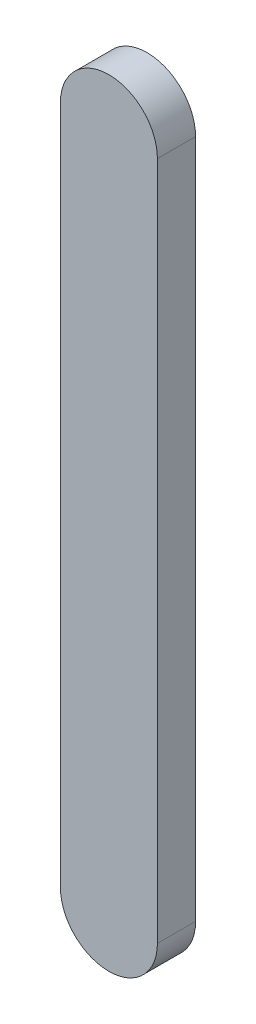
ISO-10303-21;
HEADER;
FILE_DESCRIPTION(('STEP AP214'),'2;1');
FILE_NAME('part.step','',(''),(''),'','','');
FILE_SCHEMA(('AUTOMOTIVE_DESIGN { 1 0 10303 214 1 1 1 1 }'));
ENDSEC;
DATA;
#1=APPLICATION_CONTEXT('core data for automotive mechanical design processes');
#2=APPLICATION_PROTOCOL_DEFINITION('international standard','automotive_design',2000,#1);
#3=PRODUCT_CONTEXT('',#1,'mechanical');
#4=PRODUCT('Part','Part','',(#3));
#5=PRODUCT_RELATED_PRODUCT_CATEGORY('part','',(#4));
#6=PRODUCT_DEFINITION_FORMATION('','',#4);
#7=PRODUCT_DEFINITION_CONTEXT('part definition',#1,'design');
#8=PRODUCT_DEFINITION('design','',#6,#7);
#9=PRODUCT_DEFINITION_SHAPE('','',#8);
#10=(LENGTH_UNIT() NAMED_UNIT(*) SI_UNIT(.MILLI.,.METRE.));
#11=(NAMED_UNIT(*) PLANE_ANGLE_UNIT() SI_UNIT($,.RADIAN.));
#12=(NAMED_UNIT(*) SI_UNIT($,.STERADIAN.) SOLID_ANGLE_UNIT());
#13=UNCERTAINTY_MEASURE_WITH_UNIT(LENGTH_MEASURE(1.E-05),#10,'distance_accuracy_value','');
#14=(GEOMETRIC_REPRESENTATION_CONTEXT(3) GLOBAL_UNCERTAINTY_ASSIGNED_CONTEXT((#13)) GLOBAL_UNIT_ASSIGNED_CONTEXT((#10,
#11,#12)) REPRESENTATION_CONTEXT('',''));
#15=CARTESIAN_POINT('',(0.,0.,0.));
#16=DIRECTION('',(0.,0.,1.));
#17=DIRECTION('',(1.,0.,0.));
#18=AXIS2_PLACEMENT_3D('',#15,#16,#17);
#19=CARTESIAN_POINT('',(111.887,93.4690028,0.));
#20=DIRECTION('',(-1.,0.,0.));
#21=DIRECTION('',(0.,1.,0.));
#22=AXIS2_PLACEMENT_3D('',#19,#20,#21);
#23=PLANE('',#22);
#24=DIRECTION('',(0.,1.,0.));
#25=VECTOR('',#24,1.);
#26=CARTESIAN_POINT('',(111.887,93.4690028,0.1999996));
#27=LINE('',#26,#25);
#28=CARTESIAN_POINT('',(111.887,93.4690028,0.1999996));
#29=VERTEX_POINT('',#28);
#30=CARTESIAN_POINT('',(111.887,97.028,0.1999996));
#31=VERTEX_POINT('',#30);
#32=EDGE_CURVE('E11',#29,#31,#27,.T.);
#33=ORIENTED_EDGE('',*,*,#32,.F.);
#34=DIRECTION('',(0.,0.,1.));
#35=VECTOR('',#34,1.);
#36=CARTESIAN_POINT('',(111.887,93.4690028,0.));
#37=LINE('',#36,#35);
#38=CARTESIAN_POINT('',(111.887,93.4690028,0.));
#39=VERTEX_POINT('',#38);
#40=EDGE_CURVE('E24',#39,#29,#37,.T.);
#41=ORIENTED_EDGE('',*,*,#40,.F.);
#42=DIRECTION('',(0.,1.,0.));
#43=VECTOR('',#42,1.);
#44=CARTESIAN_POINT('',(111.887,93.4690028,0.));
#45=LINE('',#44,#43);
#46=CARTESIAN_POINT('',(111.887,97.028,0.));
#47=VERTEX_POINT('',#46);
#48=EDGE_CURVE('E75',#39,#47,#45,.T.);
#49=ORIENTED_EDGE('',*,*,#48,.T.);
#50=DIRECTION('',(0.,0.,1.));
#51=VECTOR('',#50,1.);
#52=CARTESIAN_POINT('',(111.887,97.028,0.));
#53=LINE('',#52,#51);
#54=EDGE_CURVE('E37',#47,#31,#53,.T.);
#55=ORIENTED_EDGE('',*,*,#54,.T.);
#56=EDGE_LOOP('',(#33,#41,#49,#55));
#57=FACE_BOUND('',#56,.T.);
#58=ADVANCED_FACE('F17',(#57),#23,.F.);
#59=CARTESIAN_POINT('',(111.633,97.028,0.));
#60=DIRECTION('',(0.,0.,-1.));
#61=DIRECTION('',(1.,0.,0.));
#62=AXIS2_PLACEMENT_3D('',#59,#60,#61);
#63=CYLINDRICAL_SURFACE('',#62,0.253999999999995);
#64=CARTESIAN_POINT('',(111.633,97.028,0.1999996));
#65=DIRECTION('',(0.,0.,1.));
#66=DIRECTION('',(1.,0.,0.));
#67=AXIS2_PLACEMENT_3D('',#64,#65,#66);
#68=CIRCLE('',#67,0.253999999999995);
#69=CARTESIAN_POINT('',(111.379,97.028,0.1999996));
#70=VERTEX_POINT('',#69);
#71=EDGE_CURVE('E83',#31,#70,#68,.T.);
#72=ORIENTED_EDGE('',*,*,#71,.F.);
#73=ORIENTED_EDGE('',*,*,#54,.F.);
#74=CARTESIAN_POINT('',(111.633,97.028,0.));
#75=DIRECTION('',(0.,0.,1.));
#76=DIRECTION('',(1.,0.,0.));
#77=AXIS2_PLACEMENT_3D('',#74,#75,#76);
#78=CIRCLE('',#77,0.253999999999995);
#79=CARTESIAN_POINT('',(111.379,97.028,0.));
#80=VERTEX_POINT('',#79);
#81=EDGE_CURVE('E81',#47,#80,#78,.T.);
#82=ORIENTED_EDGE('',*,*,#81,.T.);
#83=DIRECTION('',(0.,0.,1.));
#84=VECTOR('',#83,1.);
#85=CARTESIAN_POINT('',(111.379,97.028,0.));
#86=LINE('',#85,#84);
#87=EDGE_CURVE('E67',#80,#70,#86,.T.);
#88=ORIENTED_EDGE('',*,*,#87,.T.);
#89=EDGE_LOOP('',(#72,#73,#82,#88));
#90=FACE_BOUND('',#89,.T.);
#91=ADVANCED_FACE('F89',(#90),#63,.T.);
#92=CARTESIAN_POINT('',(111.379,97.028,0.));
#93=DIRECTION('',(1.,0.,0.));
#94=DIRECTION('',(0.,-1.,0.));
#95=AXIS2_PLACEMENT_3D('',#92,#93,#94);
#96=PLANE('',#95);
#97=DIRECTION('',(0.,-1.,0.));
#98=VECTOR('',#97,1.);
#99=CARTESIAN_POINT('',(111.379,97.028,0.1999996));
#100=LINE('',#99,#98);
#101=CARTESIAN_POINT('',(111.379,93.4690028,0.1999996));
#102=VERTEX_POINT('',#101);
#103=EDGE_CURVE('E71',#70,#102,#100,.T.);
#104=ORIENTED_EDGE('',*,*,#103,.F.);
#105=ORIENTED_EDGE('',*,*,#87,.F.);
#106=DIRECTION('',(0.,-1.,0.));
#107=VECTOR('',#106,1.);
#108=CARTESIAN_POINT('',(111.379,97.028,0.));
#109=LINE('',#108,#107);
#110=CARTESIAN_POINT('',(111.379,93.4690028,0.));
#111=VERTEX_POINT('',#110);
#112=EDGE_CURVE('E63',#80,#111,#109,.T.);
#113=ORIENTED_EDGE('',*,*,#112,.T.);
#114=DIRECTION('',(0.,0.,1.));
#115=VECTOR('',#114,1.);
#116=CARTESIAN_POINT('',(111.379,93.4690028,0.));
#117=LINE('',#116,#115);
#118=EDGE_CURVE('E53',#111,#102,#117,.T.);
#119=ORIENTED_EDGE('',*,*,#118,.T.);
#120=EDGE_LOOP('',(#104,#105,#113,#119));
#121=FACE_BOUND('',#120,.T.);
#122=ADVANCED_FACE('F66',(#121),#96,.F.);
#123=CARTESIAN_POINT('',(111.633,93.4690028,0.));
#124=DIRECTION('',(0.,0.,-1.));
#125=DIRECTION('',(-1.,0.,0.));
#126=AXIS2_PLACEMENT_3D('',#123,#124,#125);
#127=CYLINDRICAL_SURFACE('',#126,0.253999999999995);
#128=CARTESIAN_POINT('',(111.633,93.4690028,0.1999996));
#129=DIRECTION('',(0.,0.,1.));
#130=DIRECTION('',(-1.,0.,0.));
#131=AXIS2_PLACEMENT_3D('',#128,#129,#130);
#132=CIRCLE('',#131,0.253999999999995);
#133=EDGE_CURVE('E59',#102,#29,#132,.T.);
#134=ORIENTED_EDGE('',*,*,#133,.F.);
#135=ORIENTED_EDGE('',*,*,#118,.F.);
#136=CARTESIAN_POINT('',(111.633,93.4690028,0.));
#137=DIRECTION('',(0.,0.,1.));
#138=DIRECTION('',(-1.,0.,0.));
#139=AXIS2_PLACEMENT_3D('',#136,#137,#138);
#140=CIRCLE('',#139,0.253999999999995);
#141=EDGE_CURVE('E57',#111,#39,#140,.T.);
#142=ORIENTED_EDGE('',*,*,#141,.T.);
#143=ORIENTED_EDGE('',*,*,#40,.T.);
#144=EDGE_LOOP('',(#134,#135,#142,#143));
#145=FACE_BOUND('',#144,.T.);
#146=ADVANCED_FACE('F55',(#145),#127,.T.);
#147=CARTESIAN_POINT('',(111.887,93.4690028,0.));
#148=DIRECTION('',(0.,0.,-1.));
#149=DIRECTION('',(-1.,0.,0.));
#150=AXIS2_PLACEMENT_3D('',#147,#148,#149);
#151=PLANE('',#150);
#152=ORIENTED_EDGE('',*,*,#141,.F.);
#153=ORIENTED_EDGE('',*,*,#112,.F.);
#154=ORIENTED_EDGE('',*,*,#81,.F.);
#155=ORIENTED_EDGE('',*,*,#48,.F.);
#156=EDGE_LOOP('',(#152,#153,#154,#155));
#157=FACE_BOUND('',#156,.T.);
#158=ADVANCED_FACE('F74',(#157),#151,.T.);
#159=CARTESIAN_POINT('',(111.887,93.4690028,0.1999996));
#160=DIRECTION('',(0.,0.,-1.));
#161=DIRECTION('',(-1.,0.,0.));
#162=AXIS2_PLACEMENT_3D('',#159,#160,#161);
#163=PLANE('',#162);
#164=ORIENTED_EDGE('',*,*,#32,.T.);
#165=ORIENTED_EDGE('',*,*,#71,.T.);
#166=ORIENTED_EDGE('',*,*,#103,.T.);
#167=ORIENTED_EDGE('',*,*,#133,.T.);
#168=EDGE_LOOP('',(#164,#165,#166,#167));
#169=FACE_BOUND('',#168,.T.);
#170=ADVANCED_FACE('F91',(#169),#163,.F.);
#171=CLOSED_SHELL('',(#58,#91,#122,#146,#158,#170));
#172=MANIFOLD_SOLID_BREP('B1',#171);
#173=ADVANCED_BREP_SHAPE_REPRESENTATION('',(#18,#172),#14);
#174=SHAPE_DEFINITION_REPRESENTATION(#9,#173);
ENDSEC;
END-ISO-10303-21;
